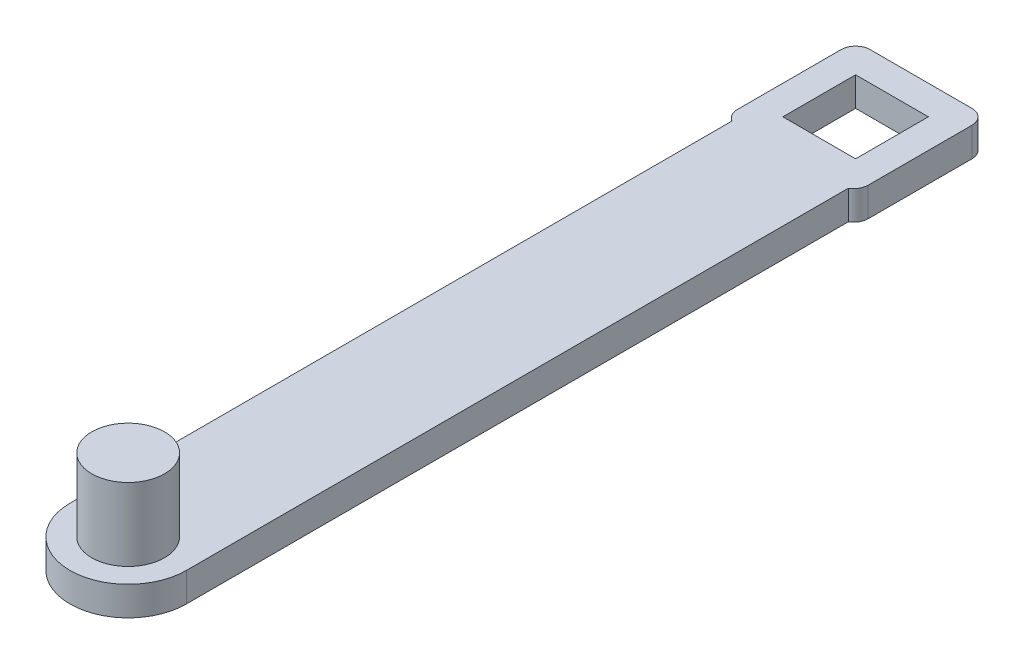
ISO-10303-21;
HEADER;
FILE_DESCRIPTION(('STEP AP214'),'2;1');
FILE_NAME('part.step','',(''),(''),'','','');
FILE_SCHEMA(('AUTOMOTIVE_DESIGN { 1 0 10303 214 1 1 1 1 }'));
ENDSEC;
DATA;
#1=APPLICATION_CONTEXT('core data for automotive mechanical design processes');
#2=APPLICATION_PROTOCOL_DEFINITION('international standard','automotive_design',2000,#1);
#3=PRODUCT_CONTEXT('',#1,'mechanical');
#4=PRODUCT('Part','Part','',(#3));
#5=PRODUCT_RELATED_PRODUCT_CATEGORY('part','',(#4));
#6=PRODUCT_DEFINITION_FORMATION('','',#4);
#7=PRODUCT_DEFINITION_CONTEXT('part definition',#1,'design');
#8=PRODUCT_DEFINITION('design','',#6,#7);
#9=PRODUCT_DEFINITION_SHAPE('','',#8);
#10=(LENGTH_UNIT() NAMED_UNIT(*) SI_UNIT(.MILLI.,.METRE.));
#11=(NAMED_UNIT(*) PLANE_ANGLE_UNIT() SI_UNIT($,.RADIAN.));
#12=(NAMED_UNIT(*) SI_UNIT($,.STERADIAN.) SOLID_ANGLE_UNIT());
#13=UNCERTAINTY_MEASURE_WITH_UNIT(LENGTH_MEASURE(1.E-05),#10,'distance_accuracy_value','');
#14=(GEOMETRIC_REPRESENTATION_CONTEXT(3) GLOBAL_UNCERTAINTY_ASSIGNED_CONTEXT((#13)) GLOBAL_UNIT_ASSIGNED_CONTEXT((#10,
#11,#12)) REPRESENTATION_CONTEXT('',''));
#15=CARTESIAN_POINT('',(0.,0.,0.));
#16=DIRECTION('',(0.,0.,1.));
#17=DIRECTION('',(1.,0.,0.));
#18=AXIS2_PLACEMENT_3D('',#15,#16,#17);
#19=CARTESIAN_POINT('',(-4.65526315789474,1.,0.));
#20=DIRECTION('',(1.,0.,0.));
#21=DIRECTION('',(0.,0.,-1.));
#22=AXIS2_PLACEMENT_3D('',#19,#20,#21);
#23=PLANE('',#22);
#24=DIRECTION('',(0.,0.,1.));
#25=VECTOR('',#24,1.);
#26=CARTESIAN_POINT('',(-4.65526315789474,-1.,0.));
#27=LINE('',#26,#25);
#28=CARTESIAN_POINT('',(-4.65526315789474,-1.,-12.0447368421053));
#29=VERTEX_POINT('',#28);
#30=CARTESIAN_POINT('',(-4.65526315789474,-1.,-7.04473684210527));
#31=VERTEX_POINT('',#30);
#32=EDGE_CURVE('E228',#29,#31,#27,.T.);
#33=ORIENTED_EDGE('',*,*,#32,.F.);
#34=DIRECTION('',(0.,-1.,0.));
#35=VECTOR('',#34,1.);
#36=CARTESIAN_POINT('',(-4.65526315789474,1.,-12.0447368421053));
#37=LINE('',#36,#35);
#38=CARTESIAN_POINT('',(-4.65526315789474,1.,-12.0447368421053));
#39=VERTEX_POINT('',#38);
#40=EDGE_CURVE('E252',#39,#29,#37,.T.);
#41=ORIENTED_EDGE('',*,*,#40,.F.);
#42=DIRECTION('',(0.,0.,1.));
#43=VECTOR('',#42,1.);
#44=CARTESIAN_POINT('',(-4.65526315789474,1.,0.));
#45=LINE('',#44,#43);
#46=CARTESIAN_POINT('',(-4.65526315789474,1.,-7.04473684210527));
#47=VERTEX_POINT('',#46);
#48=EDGE_CURVE('E388',#39,#47,#45,.T.);
#49=ORIENTED_EDGE('',*,*,#48,.T.);
#50=DIRECTION('',(0.,-1.,0.));
#51=VECTOR('',#50,1.);
#52=CARTESIAN_POINT('',(-4.65526315789474,1.,-7.04473684210527));
#53=LINE('',#52,#51);
#54=EDGE_CURVE('E163',#47,#31,#53,.T.);
#55=ORIENTED_EDGE('',*,*,#54,.T.);
#56=EDGE_LOOP('',(#33,#41,#49,#55));
#57=FACE_BOUND('',#56,.T.);
#58=ADVANCED_FACE('F51',(#57),#23,.T.);
#59=CARTESIAN_POINT('',(0.,1.,-12.0447368421053));
#60=DIRECTION('',(0.,0.,-1.));
#61=DIRECTION('',(-1.,0.,0.));
#62=AXIS2_PLACEMENT_3D('',#59,#60,#61);
#63=PLANE('',#62);
#64=DIRECTION('',(1.,0.,0.));
#65=VECTOR('',#64,1.);
#66=CARTESIAN_POINT('',(0.,-1.,-12.0447368421053));
#67=LINE('',#66,#65);
#68=CARTESIAN_POINT('',(0.344736842105262,-1.,-12.0447368421053));
#69=VERTEX_POINT('',#68);
#70=EDGE_CURVE('E232',#29,#69,#67,.T.);
#71=ORIENTED_EDGE('',*,*,#70,.T.);
#72=DIRECTION('',(0.,-1.,0.));
#73=VECTOR('',#72,1.);
#74=CARTESIAN_POINT('',(0.344736842105262,1.,-12.0447368421053));
#75=LINE('',#74,#73);
#76=CARTESIAN_POINT('',(0.344736842105262,1.,-12.0447368421053));
#77=VERTEX_POINT('',#76);
#78=EDGE_CURVE('E248',#77,#69,#75,.T.);
#79=ORIENTED_EDGE('',*,*,#78,.F.);
#80=DIRECTION('',(1.,0.,0.));
#81=VECTOR('',#80,1.);
#82=CARTESIAN_POINT('',(0.,1.,-12.0447368421053));
#83=LINE('',#82,#81);
#84=EDGE_CURVE('E365',#39,#77,#83,.T.);
#85=ORIENTED_EDGE('',*,*,#84,.F.);
#86=ORIENTED_EDGE('',*,*,#40,.T.);
#87=EDGE_LOOP('',(#71,#79,#85,#86));
#88=FACE_BOUND('',#87,.T.);
#89=ADVANCED_FACE('F304',(#88),#63,.F.);
#90=CARTESIAN_POINT('',(0.344736842105263,1.,0.));
#91=DIRECTION('',(1.,0.,0.));
#92=DIRECTION('',(0.,0.,-1.));
#93=AXIS2_PLACEMENT_3D('',#90,#91,#92);
#94=PLANE('',#93);
#95=DIRECTION('',(0.,0.,1.));
#96=VECTOR('',#95,1.);
#97=CARTESIAN_POINT('',(0.344736842105263,-1.,0.));
#98=LINE('',#97,#96);
#99=CARTESIAN_POINT('',(0.344736842105263,-1.,-7.04473684210527));
#100=VERTEX_POINT('',#99);
#101=EDGE_CURVE('E236',#69,#100,#98,.T.);
#102=ORIENTED_EDGE('',*,*,#101,.T.);
#103=DIRECTION('',(0.,-1.,0.));
#104=VECTOR('',#103,1.);
#105=CARTESIAN_POINT('',(0.344736842105263,1.,-7.04473684210527));
#106=LINE('',#105,#104);
#107=CARTESIAN_POINT('',(0.344736842105263,1.,-7.04473684210527));
#108=VERTEX_POINT('',#107);
#109=EDGE_CURVE('E245',#108,#100,#106,.T.);
#110=ORIENTED_EDGE('',*,*,#109,.F.);
#111=DIRECTION('',(0.,0.,1.));
#112=VECTOR('',#111,1.);
#113=CARTESIAN_POINT('',(0.344736842105263,1.,0.));
#114=LINE('',#113,#112);
#115=EDGE_CURVE('E362',#77,#108,#114,.T.);
#116=ORIENTED_EDGE('',*,*,#115,.F.);
#117=ORIENTED_EDGE('',*,*,#78,.T.);
#118=EDGE_LOOP('',(#102,#110,#116,#117));
#119=FACE_BOUND('',#118,.T.);
#120=ADVANCED_FACE('F310',(#119),#94,.F.);
#121=CARTESIAN_POINT('',(1.84473684210527,1.,0.));
#122=DIRECTION('',(1.,0.,0.));
#123=DIRECTION('',(0.,0.,-1.));
#124=AXIS2_PLACEMENT_3D('',#121,#122,#123);
#125=PLANE('',#124);
#126=DIRECTION('',(0.,0.,1.));
#127=VECTOR('',#126,1.);
#128=CARTESIAN_POINT('',(1.84473684210527,-1.,0.));
#129=LINE('',#128,#127);
#130=CARTESIAN_POINT('',(1.84473684210527,-1.,-5.04473684210526));
#131=VERTEX_POINT('',#130);
#132=CARTESIAN_POINT('',(1.84473684210527,-1.,40.4552631578947));
#133=VERTEX_POINT('',#132);
#134=EDGE_CURVE('E159',#131,#133,#129,.T.);
#135=ORIENTED_EDGE('',*,*,#134,.F.);
#136=DIRECTION('',(0.,-1.,0.));
#137=VECTOR('',#136,1.);
#138=CARTESIAN_POINT('',(1.84473684210527,1.,-5.04473684210526));
#139=LINE('',#138,#137);
#140=CARTESIAN_POINT('',(1.84473684210527,1.,-5.04473684210526));
#141=VERTEX_POINT('',#140);
#142=EDGE_CURVE('E154',#141,#131,#139,.T.);
#143=ORIENTED_EDGE('',*,*,#142,.F.);
#144=DIRECTION('',(0.,0.,1.));
#145=VECTOR('',#144,1.);
#146=CARTESIAN_POINT('',(1.84473684210527,1.,0.));
#147=LINE('',#146,#145);
#148=CARTESIAN_POINT('',(1.84473684210527,1.,40.4552631578947));
#149=VERTEX_POINT('',#148);
#150=EDGE_CURVE('E157',#141,#149,#147,.T.);
#151=ORIENTED_EDGE('',*,*,#150,.T.);
#152=DIRECTION('',(0.,-1.,0.));
#153=VECTOR('',#152,1.);
#154=CARTESIAN_POINT('',(1.84473684210527,1.,40.4552631578947));
#155=LINE('',#154,#153);
#156=EDGE_CURVE('E256',#149,#133,#155,.T.);
#157=ORIENTED_EDGE('',*,*,#156,.T.);
#158=EDGE_LOOP('',(#135,#143,#151,#157));
#159=FACE_BOUND('',#158,.T.);
#160=ADVANCED_FACE('F156',(#159),#125,.T.);
#161=CARTESIAN_POINT('',(2.34473684210526,1.,0.));
#162=DIRECTION('',(1.,0.,0.));
#163=DIRECTION('',(0.,0.,-1.));
#164=AXIS2_PLACEMENT_3D('',#161,#162,#163);
#165=PLANE('',#164);
#166=DIRECTION('',(0.,0.,1.));
#167=VECTOR('',#166,1.);
#168=CARTESIAN_POINT('',(2.34473684210526,1.,0.));
#169=LINE('',#168,#167);
#170=CARTESIAN_POINT('',(2.34473684210526,1.,-13.0447368421053));
#171=VERTEX_POINT('',#170);
#172=CARTESIAN_POINT('',(2.34473684210526,1.,-5.91076224588969));
#173=VERTEX_POINT('',#172);
#174=EDGE_CURVE('E175',#171,#173,#169,.T.);
#175=ORIENTED_EDGE('',*,*,#174,.T.);
#176=DIRECTION('',(0.,1.,0.));
#177=VECTOR('',#176,1.);
#178=CARTESIAN_POINT('',(2.34473684210526,-1.,-5.91076224588969));
#179=LINE('',#178,#177);
#180=CARTESIAN_POINT('',(2.34473684210526,-1.,-5.91076224588969));
#181=VERTEX_POINT('',#180);
#182=EDGE_CURVE('E181',#173,#181,#179,.F.);
#183=ORIENTED_EDGE('',*,*,#182,.T.);
#184=DIRECTION('',(0.,0.,1.));
#185=VECTOR('',#184,1.);
#186=CARTESIAN_POINT('',(2.34473684210526,-1.,0.));
#187=LINE('',#186,#185);
#188=CARTESIAN_POINT('',(2.34473684210526,-1.,-13.0447368421053));
#189=VERTEX_POINT('',#188);
#190=EDGE_CURVE('E221',#189,#181,#187,.T.);
#191=ORIENTED_EDGE('',*,*,#190,.F.);
#192=DIRECTION('',(0.,-1.,0.));
#193=VECTOR('',#192,1.);
#194=CARTESIAN_POINT('',(2.34473684210526,1.,-13.0447368421053));
#195=LINE('',#194,#193);
#196=EDGE_CURVE('E255',#189,#171,#195,.F.);
#197=ORIENTED_EDGE('',*,*,#196,.T.);
#198=EDGE_LOOP('',(#175,#183,#191,#197));
#199=FACE_BOUND('',#198,.T.);
#200=ADVANCED_FACE('F328',(#199),#165,.T.);
#201=CARTESIAN_POINT('',(0.,1.,-14.0447368421053));
#202=DIRECTION('',(0.,0.,-1.));
#203=DIRECTION('',(-1.,0.,0.));
#204=AXIS2_PLACEMENT_3D('',#201,#202,#203);
#205=PLANE('',#204);
#206=DIRECTION('',(1.,0.,0.));
#207=VECTOR('',#206,1.);
#208=CARTESIAN_POINT('',(0.,1.,-14.0447368421053));
#209=LINE('',#208,#207);
#210=CARTESIAN_POINT('',(-5.65526315789474,1.,-14.0447368421053));
#211=VERTEX_POINT('',#210);
#212=CARTESIAN_POINT('',(1.34473684210526,1.,-14.0447368421053));
#213=VERTEX_POINT('',#212);
#214=EDGE_CURVE('E377',#211,#213,#209,.T.);
#215=ORIENTED_EDGE('',*,*,#214,.T.);
#216=DIRECTION('',(0.,-1.,0.));
#217=VECTOR('',#216,1.);
#218=CARTESIAN_POINT('',(1.34473684210526,1.,-14.0447368421053));
#219=LINE('',#218,#217);
#220=CARTESIAN_POINT('',(1.34473684210526,-1.,-14.0447368421053));
#221=VERTEX_POINT('',#220);
#222=EDGE_CURVE('E188',#213,#221,#219,.T.);
#223=ORIENTED_EDGE('',*,*,#222,.T.);
#224=DIRECTION('',(1.,0.,0.));
#225=VECTOR('',#224,1.);
#226=CARTESIAN_POINT('',(0.,-1.,-14.0447368421053));
#227=LINE('',#226,#225);
#228=CARTESIAN_POINT('',(-5.65526315789474,-1.,-14.0447368421053));
#229=VERTEX_POINT('',#228);
#230=EDGE_CURVE('E215',#229,#221,#227,.T.);
#231=ORIENTED_EDGE('',*,*,#230,.F.);
#232=DIRECTION('',(0.,-1.,0.));
#233=VECTOR('',#232,1.);
#234=CARTESIAN_POINT('',(-5.65526315789474,1.,-14.0447368421053));
#235=LINE('',#234,#233);
#236=EDGE_CURVE('E183',#229,#211,#235,.F.);
#237=ORIENTED_EDGE('',*,*,#236,.T.);
#238=EDGE_LOOP('',(#215,#223,#231,#237));
#239=FACE_BOUND('',#238,.T.);
#240=ADVANCED_FACE('F325',(#239),#205,.T.);
#241=CARTESIAN_POINT('',(-6.65526315789474,1.,0.));
#242=DIRECTION('',(1.,0.,0.));
#243=DIRECTION('',(0.,0.,-1.));
#244=AXIS2_PLACEMENT_3D('',#241,#242,#243);
#245=PLANE('',#244);
#246=DIRECTION('',(0.,0.,1.));
#247=VECTOR('',#246,1.);
#248=CARTESIAN_POINT('',(-6.65526315789474,-1.,0.));
#249=LINE('',#248,#247);
#250=CARTESIAN_POINT('',(-6.65526315789474,-1.,-13.0447368421053));
#251=VERTEX_POINT('',#250);
#252=CARTESIAN_POINT('',(-6.65526315789474,-1.,-5.91076224588971));
#253=VERTEX_POINT('',#252);
#254=EDGE_CURVE('E201',#251,#253,#249,.T.);
#255=ORIENTED_EDGE('',*,*,#254,.T.);
#256=DIRECTION('',(0.,-1.,0.));
#257=VECTOR('',#256,1.);
#258=CARTESIAN_POINT('',(-6.65526315789474,1.,-5.91076224588971));
#259=LINE('',#258,#257);
#260=CARTESIAN_POINT('',(-6.65526315789474,1.,-5.91076224588971));
#261=VERTEX_POINT('',#260);
#262=EDGE_CURVE('E11',#253,#261,#259,.F.);
#263=ORIENTED_EDGE('',*,*,#262,.T.);
#264=DIRECTION('',(0.,0.,1.));
#265=VECTOR('',#264,1.);
#266=CARTESIAN_POINT('',(-6.65526315789474,1.,0.));
#267=LINE('',#266,#265);
#268=CARTESIAN_POINT('',(-6.65526315789474,1.,-13.0447368421053));
#269=VERTEX_POINT('',#268);
#270=EDGE_CURVE('E202',#269,#261,#267,.T.);
#271=ORIENTED_EDGE('',*,*,#270,.F.);
#272=DIRECTION('',(0.,-1.,0.));
#273=VECTOR('',#272,1.);
#274=CARTESIAN_POINT('',(-6.65526315789474,-1.,-13.0447368421053));
#275=LINE('',#274,#273);
#276=EDGE_CURVE('E60',#269,#251,#275,.T.);
#277=ORIENTED_EDGE('',*,*,#276,.T.);
#278=EDGE_LOOP('',(#255,#263,#271,#277));
#279=FACE_BOUND('',#278,.T.);
#280=ADVANCED_FACE('F200',(#279),#245,.F.);
#281=CARTESIAN_POINT('',(-6.15526315789473,1.,0.));
#282=DIRECTION('',(1.,0.,0.));
#283=DIRECTION('',(0.,0.,-1.));
#284=AXIS2_PLACEMENT_3D('',#281,#282,#283);
#285=PLANE('',#284);
#286=DIRECTION('',(0.,0.,1.));
#287=VECTOR('',#286,1.);
#288=CARTESIAN_POINT('',(-6.15526315789473,-1.,0.));
#289=LINE('',#288,#287);
#290=CARTESIAN_POINT('',(-6.15526315789474,-1.,-5.04473684210527));
#291=VERTEX_POINT('',#290);
#292=CARTESIAN_POINT('',(-6.15526315789473,-1.,40.4552631578947));
#293=VERTEX_POINT('',#292);
#294=EDGE_CURVE('E214',#291,#293,#289,.T.);
#295=ORIENTED_EDGE('',*,*,#294,.T.);
#296=DIRECTION('',(0.,-1.,0.));
#297=VECTOR('',#296,1.);
#298=CARTESIAN_POINT('',(-6.15526315789473,1.,40.4552631578947));
#299=LINE('',#298,#297);
#300=CARTESIAN_POINT('',(-6.15526315789473,1.,40.4552631578947));
#301=VERTEX_POINT('',#300);
#302=EDGE_CURVE('E259',#301,#293,#299,.T.);
#303=ORIENTED_EDGE('',*,*,#302,.F.);
#304=DIRECTION('',(0.,0.,1.));
#305=VECTOR('',#304,1.);
#306=CARTESIAN_POINT('',(-6.15526315789473,1.,0.));
#307=LINE('',#306,#305);
#308=CARTESIAN_POINT('',(-6.15526315789474,1.,-5.04473684210527));
#309=VERTEX_POINT('',#308);
#310=EDGE_CURVE('E285',#309,#301,#307,.T.);
#311=ORIENTED_EDGE('',*,*,#310,.F.);
#312=DIRECTION('',(0.,-1.,0.));
#313=VECTOR('',#312,1.);
#314=CARTESIAN_POINT('',(-6.15526315789474,1.,-5.04473684210527));
#315=LINE('',#314,#313);
#316=EDGE_CURVE('E164',#309,#291,#315,.T.);
#317=ORIENTED_EDGE('',*,*,#316,.T.);
#318=EDGE_LOOP('',(#295,#303,#311,#317));
#319=FACE_BOUND('',#318,.T.);
#320=ADVANCED_FACE('F290',(#319),#285,.F.);
#321=CARTESIAN_POINT('',(-2.15526315789473,1.,40.4552631578947));
#322=DIRECTION('',(0.,-1.,0.));
#323=DIRECTION('',(0.,0.,-1.));
#324=AXIS2_PLACEMENT_3D('',#321,#322,#323);
#325=CYLINDRICAL_SURFACE('',#324,4.);
#326=CARTESIAN_POINT('',(-2.15526315789473,-1.,40.4552631578947));
#327=DIRECTION('',(0.,1.,0.));
#328=DIRECTION('',(0.,0.,1.));
#329=AXIS2_PLACEMENT_3D('',#326,#327,#328);
#330=CIRCLE('',#329,4.);
#331=EDGE_CURVE('E219',#293,#133,#330,.T.);
#332=ORIENTED_EDGE('',*,*,#331,.T.);
#333=ORIENTED_EDGE('',*,*,#156,.F.);
#334=CARTESIAN_POINT('',(-2.15526315789473,1.,40.4552631578947));
#335=DIRECTION('',(0.,1.,0.));
#336=DIRECTION('',(0.,0.,1.));
#337=AXIS2_PLACEMENT_3D('',#334,#335,#336);
#338=CIRCLE('',#337,4.);
#339=EDGE_CURVE('E172',#301,#149,#338,.T.);
#340=ORIENTED_EDGE('',*,*,#339,.F.);
#341=ORIENTED_EDGE('',*,*,#302,.T.);
#342=EDGE_LOOP('',(#332,#333,#340,#341));
#343=FACE_BOUND('',#342,.T.);
#344=ADVANCED_FACE('F316',(#343),#325,.T.);
#345=CARTESIAN_POINT('',(0.,1.,-7.04473684210527));
#346=DIRECTION('',(0.,0.,-1.));
#347=DIRECTION('',(-1.,0.,0.));
#348=AXIS2_PLACEMENT_3D('',#345,#346,#347);
#349=PLANE('',#348);
#350=DIRECTION('',(1.,0.,0.));
#351=VECTOR('',#350,1.);
#352=CARTESIAN_POINT('',(0.,-1.,-7.04473684210527));
#353=LINE('',#352,#351);
#354=EDGE_CURVE('E176',#31,#100,#353,.T.);
#355=ORIENTED_EDGE('',*,*,#354,.F.);
#356=ORIENTED_EDGE('',*,*,#54,.F.);
#357=DIRECTION('',(1.,0.,0.));
#358=VECTOR('',#357,1.);
#359=CARTESIAN_POINT('',(0.,1.,-7.04473684210527));
#360=LINE('',#359,#358);
#361=EDGE_CURVE('E260',#47,#108,#360,.T.);
#362=ORIENTED_EDGE('',*,*,#361,.T.);
#363=ORIENTED_EDGE('',*,*,#109,.T.);
#364=EDGE_LOOP('',(#355,#356,#362,#363));
#365=FACE_BOUND('',#364,.T.);
#366=ADVANCED_FACE('F319',(#365),#349,.T.);
#367=CARTESIAN_POINT('',(0.,1.,0.));
#368=DIRECTION('',(0.,1.,0.));
#369=DIRECTION('',(0.,0.,1.));
#370=AXIS2_PLACEMENT_3D('',#367,#368,#369);
#371=PLANE('',#370);
#372=CARTESIAN_POINT('',(-2.15526315789473,1.,40.4552631578947));
#373=DIRECTION('',(0.,1.,0.));
#374=DIRECTION('',(0.,0.,1.));
#375=AXIS2_PLACEMENT_3D('',#372,#373,#374);
#376=CIRCLE('',#375,2.5);
#377=CARTESIAN_POINT('',(-2.15526315789473,1.,42.9552631578947));
#378=VERTEX_POINT('',#377);
#379=EDGE_CURVE('E394',#378,#378,#376,.T.);
#380=ORIENTED_EDGE('',*,*,#379,.F.);
#381=EDGE_LOOP('',(#380));
#382=FACE_BOUND('',#381,.T.);
#383=ORIENTED_EDGE('',*,*,#150,.F.);
#384=CARTESIAN_POINT('',(1.34473684210526,1.,-5.91076224588969));
#385=DIRECTION('',(0.,1.,0.));
#386=DIRECTION('',(0.,0.,1.));
#387=AXIS2_PLACEMENT_3D('',#384,#385,#386);
#388=CIRCLE('',#387,1.);
#389=EDGE_CURVE('E169',#141,#173,#388,.T.);
#390=ORIENTED_EDGE('',*,*,#389,.T.);
#391=ORIENTED_EDGE('',*,*,#174,.F.);
#392=CARTESIAN_POINT('',(1.34473684210526,1.,-13.0447368421053));
#393=DIRECTION('',(0.,1.,0.));
#394=DIRECTION('',(0.,0.,1.));
#395=AXIS2_PLACEMENT_3D('',#392,#393,#394);
#396=CIRCLE('',#395,1.);
#397=EDGE_CURVE('E184',#171,#213,#396,.T.);
#398=ORIENTED_EDGE('',*,*,#397,.T.);
#399=ORIENTED_EDGE('',*,*,#214,.F.);
#400=CARTESIAN_POINT('',(-5.65526315789474,1.,-13.0447368421053));
#401=DIRECTION('',(0.,1.,0.));
#402=DIRECTION('',(0.,0.,1.));
#403=AXIS2_PLACEMENT_3D('',#400,#401,#402);
#404=CIRCLE('',#403,1.);
#405=EDGE_CURVE('E72',#211,#269,#404,.T.);
#406=ORIENTED_EDGE('',*,*,#405,.T.);
#407=ORIENTED_EDGE('',*,*,#270,.T.);
#408=CARTESIAN_POINT('',(-5.65526315789474,1.,-5.91076224588971));
#409=DIRECTION('',(0.,1.,0.));
#410=DIRECTION('',(0.,0.,1.));
#411=AXIS2_PLACEMENT_3D('',#408,#409,#410);
#412=CIRCLE('',#411,1.);
#413=EDGE_CURVE('E190',#261,#309,#412,.T.);
#414=ORIENTED_EDGE('',*,*,#413,.T.);
#415=ORIENTED_EDGE('',*,*,#310,.T.);
#416=ORIENTED_EDGE('',*,*,#339,.T.);
#417=EDGE_LOOP('',(#383,#390,#391,#398,#399,#406,#407,#414,#415,#416));
#418=FACE_BOUND('',#417,.T.);
#419=ORIENTED_EDGE('',*,*,#48,.F.);
#420=ORIENTED_EDGE('',*,*,#84,.T.);
#421=ORIENTED_EDGE('',*,*,#115,.T.);
#422=ORIENTED_EDGE('',*,*,#361,.F.);
#423=EDGE_LOOP('',(#419,#420,#421,#422));
#424=FACE_BOUND('',#423,.T.);
#425=ADVANCED_FACE('F166',(#382,#418,#424),#371,.T.);
#426=CARTESIAN_POINT('',(0.,-1.,0.));
#427=DIRECTION('',(0.,1.,0.));
#428=DIRECTION('',(0.,0.,1.));
#429=AXIS2_PLACEMENT_3D('',#426,#427,#428);
#430=PLANE('',#429);
#431=ORIENTED_EDGE('',*,*,#190,.T.);
#432=CARTESIAN_POINT('',(1.34473684210526,-1.,-5.91076224588969));
#433=DIRECTION('',(0.,1.,0.));
#434=DIRECTION('',(0.,0.,1.));
#435=AXIS2_PLACEMENT_3D('',#432,#433,#434);
#436=CIRCLE('',#435,1.);
#437=EDGE_CURVE('E278',#181,#131,#436,.F.);
#438=ORIENTED_EDGE('',*,*,#437,.T.);
#439=ORIENTED_EDGE('',*,*,#134,.T.);
#440=ORIENTED_EDGE('',*,*,#331,.F.);
#441=ORIENTED_EDGE('',*,*,#294,.F.);
#442=CARTESIAN_POINT('',(-5.65526315789474,-1.,-5.91076224588971));
#443=DIRECTION('',(0.,1.,0.));
#444=DIRECTION('',(0.,0.,1.));
#445=AXIS2_PLACEMENT_3D('',#442,#443,#444);
#446=CIRCLE('',#445,1.);
#447=EDGE_CURVE('E212',#291,#253,#446,.F.);
#448=ORIENTED_EDGE('',*,*,#447,.T.);
#449=ORIENTED_EDGE('',*,*,#254,.F.);
#450=CARTESIAN_POINT('',(-5.65526315789474,-1.,-13.0447368421053));
#451=DIRECTION('',(0.,1.,0.));
#452=DIRECTION('',(0.,0.,1.));
#453=AXIS2_PLACEMENT_3D('',#450,#451,#452);
#454=CIRCLE('',#453,1.);
#455=EDGE_CURVE('E209',#251,#229,#454,.F.);
#456=ORIENTED_EDGE('',*,*,#455,.T.);
#457=ORIENTED_EDGE('',*,*,#230,.T.);
#458=CARTESIAN_POINT('',(1.34473684210526,-1.,-13.0447368421053));
#459=DIRECTION('',(0.,1.,0.));
#460=DIRECTION('',(0.,0.,1.));
#461=AXIS2_PLACEMENT_3D('',#458,#459,#460);
#462=CIRCLE('',#461,1.);
#463=EDGE_CURVE('E275',#221,#189,#462,.F.);
#464=ORIENTED_EDGE('',*,*,#463,.T.);
#465=EDGE_LOOP('',(#431,#438,#439,#440,#441,#448,#449,#456,#457,#464));
#466=FACE_BOUND('',#465,.T.);
#467=ORIENTED_EDGE('',*,*,#32,.T.);
#468=ORIENTED_EDGE('',*,*,#354,.T.);
#469=ORIENTED_EDGE('',*,*,#101,.F.);
#470=ORIENTED_EDGE('',*,*,#70,.F.);
#471=EDGE_LOOP('',(#467,#468,#469,#470));
#472=FACE_BOUND('',#471,.T.);
#473=ADVANCED_FACE('F206',(#466,#472),#430,.F.);
#474=CARTESIAN_POINT('',(1.34473684210526,1.,-5.91076224588969));
#475=DIRECTION('',(0.,-1.,0.));
#476=DIRECTION('',(0.,0.,-1.));
#477=AXIS2_PLACEMENT_3D('',#474,#475,#476);
#478=CYLINDRICAL_SURFACE('',#477,1.);
#479=ORIENTED_EDGE('',*,*,#389,.F.);
#480=ORIENTED_EDGE('',*,*,#142,.T.);
#481=ORIENTED_EDGE('',*,*,#437,.F.);
#482=ORIENTED_EDGE('',*,*,#182,.F.);
#483=EDGE_LOOP('',(#479,#480,#481,#482));
#484=FACE_BOUND('',#483,.T.);
#485=ADVANCED_FACE('F179',(#484),#478,.T.);
#486=CARTESIAN_POINT('',(1.34473684210526,1.,-13.0447368421053));
#487=DIRECTION('',(0.,-1.,0.));
#488=DIRECTION('',(0.,0.,-1.));
#489=AXIS2_PLACEMENT_3D('',#486,#487,#488);
#490=CYLINDRICAL_SURFACE('',#489,1.);
#491=ORIENTED_EDGE('',*,*,#397,.F.);
#492=ORIENTED_EDGE('',*,*,#196,.F.);
#493=ORIENTED_EDGE('',*,*,#463,.F.);
#494=ORIENTED_EDGE('',*,*,#222,.F.);
#495=EDGE_LOOP('',(#491,#492,#493,#494));
#496=FACE_BOUND('',#495,.T.);
#497=ADVANCED_FACE('F295',(#496),#490,.T.);
#498=CARTESIAN_POINT('',(-5.65526315789474,1.,-5.91076224588971));
#499=DIRECTION('',(0.,-1.,0.));
#500=DIRECTION('',(0.,0.,-1.));
#501=AXIS2_PLACEMENT_3D('',#498,#499,#500);
#502=CYLINDRICAL_SURFACE('',#501,1.);
#503=ORIENTED_EDGE('',*,*,#413,.F.);
#504=ORIENTED_EDGE('',*,*,#262,.F.);
#505=ORIENTED_EDGE('',*,*,#447,.F.);
#506=ORIENTED_EDGE('',*,*,#316,.F.);
#507=EDGE_LOOP('',(#503,#504,#505,#506));
#508=FACE_BOUND('',#507,.T.);
#509=ADVANCED_FACE('F293',(#508),#502,.T.);
#510=CARTESIAN_POINT('',(-5.65526315789474,1.,-13.0447368421053));
#511=DIRECTION('',(0.,1.,0.));
#512=DIRECTION('',(0.,0.,1.));
#513=AXIS2_PLACEMENT_3D('',#510,#511,#512);
#514=CYLINDRICAL_SURFACE('',#513,1.);
#515=ORIENTED_EDGE('',*,*,#405,.F.);
#516=ORIENTED_EDGE('',*,*,#236,.F.);
#517=ORIENTED_EDGE('',*,*,#455,.F.);
#518=ORIENTED_EDGE('',*,*,#276,.F.);
#519=EDGE_LOOP('',(#515,#516,#517,#518));
#520=FACE_BOUND('',#519,.T.);
#521=ADVANCED_FACE('F53',(#520),#514,.T.);
#522=CARTESIAN_POINT('',(-2.15526315789473,6.,40.4552631578947));
#523=DIRECTION('',(0.,-1.,0.));
#524=DIRECTION('',(0.,0.,-1.));
#525=AXIS2_PLACEMENT_3D('',#522,#523,#524);
#526=CYLINDRICAL_SURFACE('',#525,2.5);
#527=CARTESIAN_POINT('',(-2.15526315789473,6.,40.4552631578947));
#528=DIRECTION('',(0.,1.,0.));
#529=DIRECTION('',(0.,0.,1.));
#530=AXIS2_PLACEMENT_3D('',#527,#528,#529);
#531=CIRCLE('',#530,2.5);
#532=CARTESIAN_POINT('',(-2.15526315789473,6.,42.9552631578947));
#533=VERTEX_POINT('',#532);
#534=EDGE_CURVE('E370',#533,#533,#531,.T.);
#535=ORIENTED_EDGE('',*,*,#534,.F.);
#536=EDGE_LOOP('',(#535));
#537=FACE_BOUND('',#536,.T.);
#538=ORIENTED_EDGE('',*,*,#379,.T.);
#539=EDGE_LOOP('',(#538));
#540=FACE_BOUND('',#539,.T.);
#541=ADVANCED_FACE('F300',(#537,#540),#526,.T.);
#542=CARTESIAN_POINT('',(-2.15526315789473,6.,40.4552631578947));
#543=DIRECTION('',(0.,1.,0.));
#544=DIRECTION('',(0.,0.,1.));
#545=AXIS2_PLACEMENT_3D('',#542,#543,#544);
#546=PLANE('',#545);
#547=ORIENTED_EDGE('',*,*,#534,.T.);
#548=EDGE_LOOP('',(#547));
#549=FACE_BOUND('',#548,.T.);
#550=ADVANCED_FACE('F402',(#549),#546,.T.);
#551=CLOSED_SHELL('',(#58,#89,#120,#160,#200,#240,#280,#320,#344,#366,#425,#473,#485,#497,#509,
#521,#541,#550));
#552=MANIFOLD_SOLID_BREP('B2',#551);
#553=ADVANCED_BREP_SHAPE_REPRESENTATION('',(#18,#552),#14);
#554=SHAPE_DEFINITION_REPRESENTATION(#9,#553);
ENDSEC;
END-ISO-10303-21;
